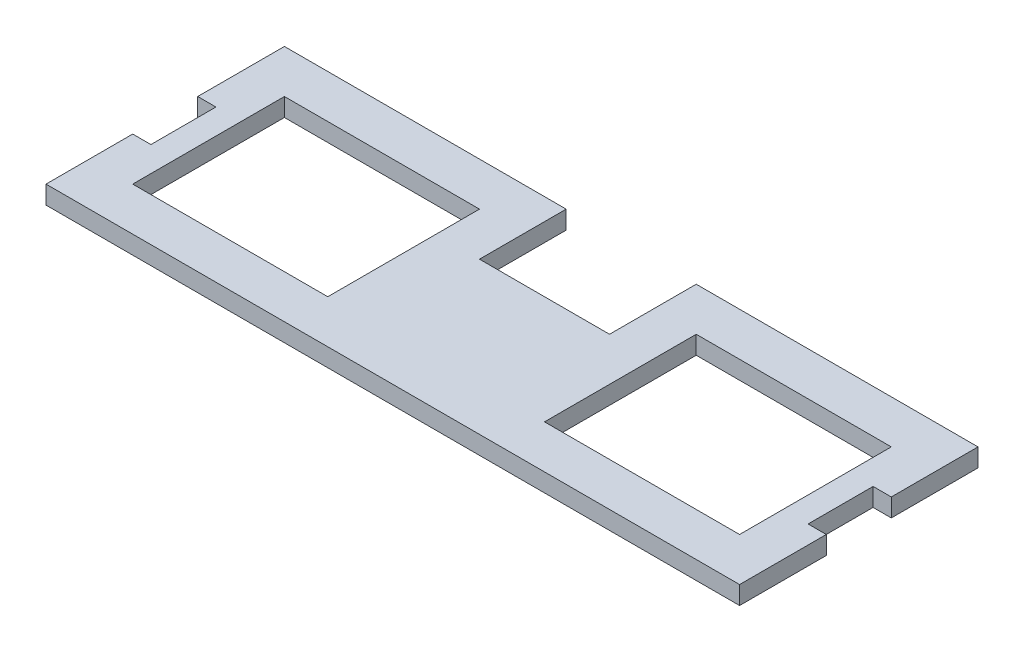
ISO-10303-21;
HEADER;
FILE_DESCRIPTION(('STEP AP214'),'2;1');
FILE_NAME('part.step','',(''),(''),'','','');
FILE_SCHEMA(('AUTOMOTIVE_DESIGN { 1 0 10303 214 1 1 1 1 }'));
ENDSEC;
DATA;
#1=APPLICATION_CONTEXT('core data for automotive mechanical design processes');
#2=APPLICATION_PROTOCOL_DEFINITION('international standard','automotive_design',2000,#1);
#3=PRODUCT_CONTEXT('',#1,'mechanical');
#4=PRODUCT('Part','Part','',(#3));
#5=PRODUCT_RELATED_PRODUCT_CATEGORY('part','',(#4));
#6=PRODUCT_DEFINITION_FORMATION('','',#4);
#7=PRODUCT_DEFINITION_CONTEXT('part definition',#1,'design');
#8=PRODUCT_DEFINITION('design','',#6,#7);
#9=PRODUCT_DEFINITION_SHAPE('','',#8);
#10=(LENGTH_UNIT() NAMED_UNIT(*) SI_UNIT(.MILLI.,.METRE.));
#11=(NAMED_UNIT(*) PLANE_ANGLE_UNIT() SI_UNIT($,.RADIAN.));
#12=(NAMED_UNIT(*) SI_UNIT($,.STERADIAN.) SOLID_ANGLE_UNIT());
#13=UNCERTAINTY_MEASURE_WITH_UNIT(LENGTH_MEASURE(1.E-05),#10,'distance_accuracy_value','');
#14=(GEOMETRIC_REPRESENTATION_CONTEXT(3) GLOBAL_UNCERTAINTY_ASSIGNED_CONTEXT((#13)) GLOBAL_UNIT_ASSIGNED_CONTEXT((#10,
#11,#12)) REPRESENTATION_CONTEXT('',''));
#15=CARTESIAN_POINT('',(0.,0.,0.));
#16=DIRECTION('',(0.,0.,1.));
#17=DIRECTION('',(1.,0.,0.));
#18=AXIS2_PLACEMENT_3D('',#15,#16,#17);
#19=CARTESIAN_POINT('',(0.,5.334,-69.85));
#20=DIRECTION('',(0.,0.,1.));
#21=DIRECTION('',(1.,0.,0.));
#22=AXIS2_PLACEMENT_3D('',#19,#20,#21);
#23=PLANE('',#22);
#24=DIRECTION('',(-1.,0.,0.));
#25=VECTOR('',#24,1.);
#26=CARTESIAN_POINT('',(0.,5.334,-69.85));
#27=LINE('',#26,#25);
#28=CARTESIAN_POINT('',(82.55,5.334,-69.85));
#29=VERTEX_POINT('',#28);
#30=CARTESIAN_POINT('',(0.,5.334,-69.85));
#31=VERTEX_POINT('',#30);
#32=EDGE_CURVE('E350',#29,#31,#27,.T.);
#33=ORIENTED_EDGE('',*,*,#32,.F.);
#34=DIRECTION('',(0.,1.,0.));
#35=VECTOR('',#34,1.);
#36=CARTESIAN_POINT('',(82.55,0.,-69.85));
#37=LINE('',#36,#35);
#38=CARTESIAN_POINT('',(82.55,0.,-69.85));
#39=VERTEX_POINT('',#38);
#40=EDGE_CURVE('E279',#39,#29,#37,.T.);
#41=ORIENTED_EDGE('',*,*,#40,.F.);
#42=DIRECTION('',(-1.,0.,0.));
#43=VECTOR('',#42,1.);
#44=CARTESIAN_POINT('',(0.,0.,-69.85));
#45=LINE('',#44,#43);
#46=CARTESIAN_POINT('',(0.,0.,-69.85));
#47=VERTEX_POINT('',#46);
#48=EDGE_CURVE('E364',#39,#47,#45,.T.);
#49=ORIENTED_EDGE('',*,*,#48,.T.);
#50=DIRECTION('',(0.,-1.,0.));
#51=VECTOR('',#50,1.);
#52=CARTESIAN_POINT('',(0.,5.334,-69.85));
#53=LINE('',#52,#51);
#54=EDGE_CURVE('E354',#31,#47,#53,.T.);
#55=ORIENTED_EDGE('',*,*,#54,.F.);
#56=EDGE_LOOP('',(#33,#41,#49,#55));
#57=FACE_BOUND('',#56,.T.);
#58=ADVANCED_FACE('F32',(#57),#23,.F.);
#59=CARTESIAN_POINT('',(203.2,5.334,0.));
#60=DIRECTION('',(-1.,0.,0.));
#61=DIRECTION('',(0.,0.,1.));
#62=AXIS2_PLACEMENT_3D('',#59,#60,#61);
#63=PLANE('',#62);
#64=DIRECTION('',(0.,0.,-1.));
#65=VECTOR('',#64,1.);
#66=CARTESIAN_POINT('',(203.2,5.334,0.));
#67=LINE('',#66,#65);
#68=CARTESIAN_POINT('',(203.2,5.334,-44.45));
#69=VERTEX_POINT('',#68);
#70=CARTESIAN_POINT('',(203.2,5.334,-69.85));
#71=VERTEX_POINT('',#70);
#72=EDGE_CURVE('E346',#69,#71,#67,.T.);
#73=ORIENTED_EDGE('',*,*,#72,.F.);
#74=DIRECTION('',(0.,1.,0.));
#75=VECTOR('',#74,1.);
#76=CARTESIAN_POINT('',(203.2,0.,-44.45));
#77=LINE('',#76,#75);
#78=CARTESIAN_POINT('',(203.2,0.,-44.45));
#79=VERTEX_POINT('',#78);
#80=EDGE_CURVE('E305',#79,#69,#77,.T.);
#81=ORIENTED_EDGE('',*,*,#80,.F.);
#82=DIRECTION('',(0.,0.,-1.));
#83=VECTOR('',#82,1.);
#84=CARTESIAN_POINT('',(203.2,0.,0.));
#85=LINE('',#84,#83);
#86=CARTESIAN_POINT('',(203.2,0.,-69.85));
#87=VERTEX_POINT('',#86);
#88=EDGE_CURVE('E360',#79,#87,#85,.T.);
#89=ORIENTED_EDGE('',*,*,#88,.T.);
#90=DIRECTION('',(0.,-1.,0.));
#91=VECTOR('',#90,1.);
#92=CARTESIAN_POINT('',(203.2,5.334,-69.85));
#93=LINE('',#92,#91);
#94=EDGE_CURVE('E370',#71,#87,#93,.T.);
#95=ORIENTED_EDGE('',*,*,#94,.F.);
#96=EDGE_LOOP('',(#73,#81,#89,#95));
#97=FACE_BOUND('',#96,.T.);
#98=ADVANCED_FACE('F438',(#97),#63,.F.);
#99=CARTESIAN_POINT('',(0.,5.334,0.));
#100=DIRECTION('',(1.,0.,0.));
#101=DIRECTION('',(0.,0.,-1.));
#102=AXIS2_PLACEMENT_3D('',#99,#100,#101);
#103=PLANE('',#102);
#104=DIRECTION('',(0.,0.,1.));
#105=VECTOR('',#104,1.);
#106=CARTESIAN_POINT('',(0.,0.,0.));
#107=LINE('',#106,#105);
#108=CARTESIAN_POINT('',(0.,0.,-44.45));
#109=VERTEX_POINT('',#108);
#110=EDGE_CURVE('E355',#47,#109,#107,.T.);
#111=ORIENTED_EDGE('',*,*,#110,.T.);
#112=DIRECTION('',(0.,1.,0.));
#113=VECTOR('',#112,1.);
#114=CARTESIAN_POINT('',(0.,0.,-44.45));
#115=LINE('',#114,#113);
#116=CARTESIAN_POINT('',(0.,5.334,-44.45));
#117=VERTEX_POINT('',#116);
#118=EDGE_CURVE('E331',#109,#117,#115,.T.);
#119=ORIENTED_EDGE('',*,*,#118,.T.);
#120=DIRECTION('',(0.,0.,1.));
#121=VECTOR('',#120,1.);
#122=CARTESIAN_POINT('',(0.,5.334,0.));
#123=LINE('',#122,#121);
#124=EDGE_CURVE('E340',#31,#117,#123,.T.);
#125=ORIENTED_EDGE('',*,*,#124,.F.);
#126=ORIENTED_EDGE('',*,*,#54,.T.);
#127=EDGE_LOOP('',(#111,#119,#125,#126));
#128=FACE_BOUND('',#127,.T.);
#129=ADVANCED_FACE('F414',(#128),#103,.F.);
#130=CARTESIAN_POINT('',(0.,5.334,-25.4));
#131=VERTEX_POINT('',#130);
#132=CARTESIAN_POINT('',(0.,5.334,0.));
#133=VERTEX_POINT('',#132);
#134=EDGE_CURVE('E344',#131,#133,#123,.T.);
#135=ORIENTED_EDGE('',*,*,#134,.F.);
#136=DIRECTION('',(0.,1.,0.));
#137=VECTOR('',#136,1.);
#138=CARTESIAN_POINT('',(0.,0.,-25.4));
#139=LINE('',#138,#137);
#140=CARTESIAN_POINT('',(0.,0.,-25.4));
#141=VERTEX_POINT('',#140);
#142=EDGE_CURVE('E324',#141,#131,#139,.T.);
#143=ORIENTED_EDGE('',*,*,#142,.F.);
#144=CARTESIAN_POINT('',(0.,0.,0.));
#145=VERTEX_POINT('',#144);
#146=EDGE_CURVE('E334',#141,#145,#107,.T.);
#147=ORIENTED_EDGE('',*,*,#146,.T.);
#148=DIRECTION('',(0.,-1.,0.));
#149=VECTOR('',#148,1.);
#150=CARTESIAN_POINT('',(0.,5.334,0.));
#151=LINE('',#150,#149);
#152=EDGE_CURVE('E11',#133,#145,#151,.T.);
#153=ORIENTED_EDGE('',*,*,#152,.F.);
#154=EDGE_LOOP('',(#135,#143,#147,#153));
#155=FACE_BOUND('',#154,.T.);
#156=ADVANCED_FACE('F34',(#155),#103,.F.);
#157=CARTESIAN_POINT('',(0.,5.334,0.));
#158=DIRECTION('',(0.,0.,-1.));
#159=DIRECTION('',(-1.,0.,0.));
#160=AXIS2_PLACEMENT_3D('',#157,#158,#159);
#161=PLANE('',#160);
#162=DIRECTION('',(1.,0.,0.));
#163=VECTOR('',#162,1.);
#164=CARTESIAN_POINT('',(0.,0.,0.));
#165=LINE('',#164,#163);
#166=CARTESIAN_POINT('',(203.2,0.,0.));
#167=VERTEX_POINT('',#166);
#168=EDGE_CURVE('E358',#145,#167,#165,.T.);
#169=ORIENTED_EDGE('',*,*,#168,.T.);
#170=DIRECTION('',(0.,-1.,0.));
#171=VECTOR('',#170,1.);
#172=CARTESIAN_POINT('',(203.2,5.334,0.));
#173=LINE('',#172,#171);
#174=CARTESIAN_POINT('',(203.2,5.334,0.));
#175=VERTEX_POINT('',#174);
#176=EDGE_CURVE('E40',#175,#167,#173,.T.);
#177=ORIENTED_EDGE('',*,*,#176,.F.);
#178=DIRECTION('',(1.,0.,0.));
#179=VECTOR('',#178,1.);
#180=CARTESIAN_POINT('',(0.,5.334,0.));
#181=LINE('',#180,#179);
#182=EDGE_CURVE('E343',#133,#175,#181,.T.);
#183=ORIENTED_EDGE('',*,*,#182,.F.);
#184=ORIENTED_EDGE('',*,*,#152,.T.);
#185=EDGE_LOOP('',(#169,#177,#183,#184));
#186=FACE_BOUND('',#185,.T.);
#187=ADVANCED_FACE('F398',(#186),#161,.F.);
#188=CARTESIAN_POINT('',(203.2,0.,-25.4));
#189=VERTEX_POINT('',#188);
#190=EDGE_CURVE('E361',#167,#189,#85,.T.);
#191=ORIENTED_EDGE('',*,*,#190,.T.);
#192=DIRECTION('',(0.,1.,0.));
#193=VECTOR('',#192,1.);
#194=CARTESIAN_POINT('',(203.2,0.,-25.4));
#195=LINE('',#194,#193);
#196=CARTESIAN_POINT('',(203.2,5.334,-25.4));
#197=VERTEX_POINT('',#196);
#198=EDGE_CURVE('E308',#189,#197,#195,.T.);
#199=ORIENTED_EDGE('',*,*,#198,.T.);
#200=EDGE_CURVE('E347',#175,#197,#67,.T.);
#201=ORIENTED_EDGE('',*,*,#200,.F.);
#202=ORIENTED_EDGE('',*,*,#176,.T.);
#203=EDGE_LOOP('',(#191,#199,#201,#202));
#204=FACE_BOUND('',#203,.T.);
#205=ADVANCED_FACE('F377',(#204),#63,.F.);
#206=CARTESIAN_POINT('',(120.65,0.,-69.85));
#207=VERTEX_POINT('',#206);
#208=EDGE_CURVE('E365',#87,#207,#45,.T.);
#209=ORIENTED_EDGE('',*,*,#208,.T.);
#210=DIRECTION('',(0.,1.,0.));
#211=VECTOR('',#210,1.);
#212=CARTESIAN_POINT('',(120.65,0.,-69.85));
#213=LINE('',#212,#211);
#214=CARTESIAN_POINT('',(120.65,5.334,-69.85));
#215=VERTEX_POINT('',#214);
#216=EDGE_CURVE('E282',#207,#215,#213,.T.);
#217=ORIENTED_EDGE('',*,*,#216,.T.);
#218=EDGE_CURVE('E351',#71,#215,#27,.T.);
#219=ORIENTED_EDGE('',*,*,#218,.F.);
#220=ORIENTED_EDGE('',*,*,#94,.T.);
#221=EDGE_LOOP('',(#209,#217,#219,#220));
#222=FACE_BOUND('',#221,.T.);
#223=ADVANCED_FACE('F433',(#222),#23,.F.);
#224=CARTESIAN_POINT('',(0.,5.334,0.));
#225=DIRECTION('',(0.,-1.,0.));
#226=DIRECTION('',(0.,0.,-1.));
#227=AXIS2_PLACEMENT_3D('',#224,#225,#226);
#228=PLANE('',#227);
#229=DIRECTION('',(1.,0.,0.));
#230=VECTOR('',#229,1.);
#231=CARTESIAN_POINT('',(12.7,5.334,-12.7));
#232=LINE('',#231,#230);
#233=CARTESIAN_POINT('',(12.7,5.334,-12.7));
#234=VERTEX_POINT('',#233);
#235=CARTESIAN_POINT('',(69.85,5.334,-12.6999999999985));
#236=VERTEX_POINT('',#235);
#237=EDGE_CURVE('E217',#234,#236,#232,.T.);
#238=ORIENTED_EDGE('',*,*,#237,.F.);
#239=DIRECTION('',(0.,0.,1.));
#240=VECTOR('',#239,1.);
#241=CARTESIAN_POINT('',(12.7,5.334,-25.4));
#242=LINE('',#241,#240);
#243=CARTESIAN_POINT('',(12.7,5.334,-57.15));
#244=VERTEX_POINT('',#243);
#245=EDGE_CURVE('E197',#244,#234,#242,.T.);
#246=ORIENTED_EDGE('',*,*,#245,.F.);
#247=DIRECTION('',(-1.,0.,0.));
#248=VECTOR('',#247,1.);
#249=CARTESIAN_POINT('',(69.85,5.334,-57.15));
#250=LINE('',#249,#248);
#251=CARTESIAN_POINT('',(69.85,5.334,-57.15));
#252=VERTEX_POINT('',#251);
#253=EDGE_CURVE('E212',#252,#244,#250,.T.);
#254=ORIENTED_EDGE('',*,*,#253,.F.);
#255=DIRECTION('',(0.,0.,-1.));
#256=VECTOR('',#255,1.);
#257=CARTESIAN_POINT('',(69.85,5.334,-44.45));
#258=LINE('',#257,#256);
#259=EDGE_CURVE('E219',#236,#252,#258,.T.);
#260=ORIENTED_EDGE('',*,*,#259,.F.);
#261=EDGE_LOOP('',(#238,#246,#254,#260));
#262=FACE_BOUND('',#261,.T.);
#263=DIRECTION('',(-1.,0.,0.));
#264=VECTOR('',#263,1.);
#265=CARTESIAN_POINT('',(133.35,5.334,-57.15));
#266=LINE('',#265,#264);
#267=CARTESIAN_POINT('',(190.5,5.334,-57.15));
#268=VERTEX_POINT('',#267);
#269=CARTESIAN_POINT('',(133.35,5.334,-57.15));
#270=VERTEX_POINT('',#269);
#271=EDGE_CURVE('E226',#268,#270,#266,.T.);
#272=ORIENTED_EDGE('',*,*,#271,.F.);
#273=DIRECTION('',(0.,0.,-1.));
#274=VECTOR('',#273,1.);
#275=CARTESIAN_POINT('',(190.5,5.334,-25.4));
#276=LINE('',#275,#274);
#277=CARTESIAN_POINT('',(190.5,5.334,-12.7));
#278=VERTEX_POINT('',#277);
#279=EDGE_CURVE('E234',#278,#268,#276,.T.);
#280=ORIENTED_EDGE('',*,*,#279,.F.);
#281=DIRECTION('',(1.,0.,0.));
#282=VECTOR('',#281,1.);
#283=CARTESIAN_POINT('',(190.5,5.334,-12.7));
#284=LINE('',#283,#282);
#285=CARTESIAN_POINT('',(133.35,5.334,-12.6999999999985));
#286=VERTEX_POINT('',#285);
#287=EDGE_CURVE('E249',#286,#278,#284,.T.);
#288=ORIENTED_EDGE('',*,*,#287,.F.);
#289=DIRECTION('',(0.,0.,1.));
#290=VECTOR('',#289,1.);
#291=CARTESIAN_POINT('',(133.35,5.334,-44.45));
#292=LINE('',#291,#290);
#293=EDGE_CURVE('E246',#270,#286,#292,.T.);
#294=ORIENTED_EDGE('',*,*,#293,.F.);
#295=EDGE_LOOP('',(#272,#280,#288,#294));
#296=FACE_BOUND('',#295,.T.);
#297=DIRECTION('',(1.,0.,0.));
#298=VECTOR('',#297,1.);
#299=CARTESIAN_POINT('',(82.55,5.334,-44.45));
#300=LINE('',#299,#298);
#301=CARTESIAN_POINT('',(82.55,5.334,-44.45));
#302=VERTEX_POINT('',#301);
#303=CARTESIAN_POINT('',(120.65,5.334,-44.45));
#304=VERTEX_POINT('',#303);
#305=EDGE_CURVE('E275',#302,#304,#300,.T.);
#306=ORIENTED_EDGE('',*,*,#305,.F.);
#307=DIRECTION('',(0.,0.,1.));
#308=VECTOR('',#307,1.);
#309=CARTESIAN_POINT('',(82.55,5.334,-69.85));
#310=LINE('',#309,#308);
#311=EDGE_CURVE('E256',#29,#302,#310,.T.);
#312=ORIENTED_EDGE('',*,*,#311,.F.);
#313=ORIENTED_EDGE('',*,*,#32,.T.);
#314=ORIENTED_EDGE('',*,*,#124,.T.);
#315=DIRECTION('',(-1.,0.,0.));
#316=VECTOR('',#315,1.);
#317=CARTESIAN_POINT('',(0.,5.334,-44.45));
#318=LINE('',#317,#316);
#319=CARTESIAN_POINT('',(5.33399999999994,5.334,-44.45));
#320=VERTEX_POINT('',#319);
#321=EDGE_CURVE('E318',#320,#117,#318,.T.);
#322=ORIENTED_EDGE('',*,*,#321,.F.);
#323=DIRECTION('',(0.,0.,-1.));
#324=VECTOR('',#323,1.);
#325=CARTESIAN_POINT('',(5.33399999999994,5.334,-44.45));
#326=LINE('',#325,#324);
#327=CARTESIAN_POINT('',(5.33399999999993,5.334,-25.4));
#328=VERTEX_POINT('',#327);
#329=EDGE_CURVE('E327',#328,#320,#326,.T.);
#330=ORIENTED_EDGE('',*,*,#329,.F.);
#331=DIRECTION('',(1.,0.,0.));
#332=VECTOR('',#331,1.);
#333=CARTESIAN_POINT('',(0.,5.334,-25.4));
#334=LINE('',#333,#332);
#335=EDGE_CURVE('E307',#131,#328,#334,.T.);
#336=ORIENTED_EDGE('',*,*,#335,.F.);
#337=ORIENTED_EDGE('',*,*,#134,.T.);
#338=ORIENTED_EDGE('',*,*,#182,.T.);
#339=ORIENTED_EDGE('',*,*,#200,.T.);
#340=DIRECTION('',(1.,0.,0.));
#341=VECTOR('',#340,1.);
#342=CARTESIAN_POINT('',(203.2,5.334,-25.4));
#343=LINE('',#342,#341);
#344=CARTESIAN_POINT('',(197.866,5.334,-25.4));
#345=VERTEX_POINT('',#344);
#346=EDGE_CURVE('E292',#345,#197,#343,.T.);
#347=ORIENTED_EDGE('',*,*,#346,.F.);
#348=DIRECTION('',(0.,0.,1.));
#349=VECTOR('',#348,1.);
#350=CARTESIAN_POINT('',(197.866,5.334,-44.45));
#351=LINE('',#350,#349);
#352=CARTESIAN_POINT('',(197.866,5.334,-44.45));
#353=VERTEX_POINT('',#352);
#354=EDGE_CURVE('E301',#353,#345,#351,.T.);
#355=ORIENTED_EDGE('',*,*,#354,.F.);
#356=DIRECTION('',(-1.,0.,0.));
#357=VECTOR('',#356,1.);
#358=CARTESIAN_POINT('',(203.2,5.334,-44.45));
#359=LINE('',#358,#357);
#360=EDGE_CURVE('E281',#69,#353,#359,.T.);
#361=ORIENTED_EDGE('',*,*,#360,.F.);
#362=ORIENTED_EDGE('',*,*,#72,.T.);
#363=ORIENTED_EDGE('',*,*,#218,.T.);
#364=DIRECTION('',(0.,0.,-1.));
#365=VECTOR('',#364,1.);
#366=CARTESIAN_POINT('',(120.65,5.334,-69.85));
#367=LINE('',#366,#365);
#368=EDGE_CURVE('E266',#304,#215,#367,.T.);
#369=ORIENTED_EDGE('',*,*,#368,.F.);
#370=EDGE_LOOP('',(#306,#312,#313,#314,#322,#330,#336,#337,#338,#339,#347,#355,#361,#362,#363,#369));
#371=FACE_BOUND('',#370,.T.);
#372=ADVANCED_FACE('F394',(#262,#296,#371),#228,.F.);
#373=CARTESIAN_POINT('',(0.,0.,0.));
#374=DIRECTION('',(0.,-1.,0.));
#375=DIRECTION('',(0.,0.,-1.));
#376=AXIS2_PLACEMENT_3D('',#373,#374,#375);
#377=PLANE('',#376);
#378=DIRECTION('',(0.,0.,1.));
#379=VECTOR('',#378,1.);
#380=CARTESIAN_POINT('',(12.7,0.,-25.4));
#381=LINE('',#380,#379);
#382=CARTESIAN_POINT('',(12.7,0.,-57.15));
#383=VERTEX_POINT('',#382);
#384=CARTESIAN_POINT('',(12.7,0.,-12.7));
#385=VERTEX_POINT('',#384);
#386=EDGE_CURVE('E194',#383,#385,#381,.T.);
#387=ORIENTED_EDGE('',*,*,#386,.T.);
#388=DIRECTION('',(1.,0.,0.));
#389=VECTOR('',#388,1.);
#390=CARTESIAN_POINT('',(12.7,0.,-12.7));
#391=LINE('',#390,#389);
#392=CARTESIAN_POINT('',(69.85,0.,-12.6999999999985));
#393=VERTEX_POINT('',#392);
#394=EDGE_CURVE('E203',#385,#393,#391,.T.);
#395=ORIENTED_EDGE('',*,*,#394,.T.);
#396=DIRECTION('',(0.,0.,-1.));
#397=VECTOR('',#396,1.);
#398=CARTESIAN_POINT('',(69.85,0.,-44.45));
#399=LINE('',#398,#397);
#400=CARTESIAN_POINT('',(69.85,0.,-57.15));
#401=VERTEX_POINT('',#400);
#402=EDGE_CURVE('E55',#393,#401,#399,.T.);
#403=ORIENTED_EDGE('',*,*,#402,.T.);
#404=DIRECTION('',(-1.,0.,0.));
#405=VECTOR('',#404,1.);
#406=CARTESIAN_POINT('',(69.85,0.,-57.15));
#407=LINE('',#406,#405);
#408=EDGE_CURVE('E200',#401,#383,#407,.T.);
#409=ORIENTED_EDGE('',*,*,#408,.T.);
#410=EDGE_LOOP('',(#387,#395,#403,#409));
#411=FACE_BOUND('',#410,.T.);
#412=DIRECTION('',(0.,0.,-1.));
#413=VECTOR('',#412,1.);
#414=CARTESIAN_POINT('',(190.5,0.,-25.4));
#415=LINE('',#414,#413);
#416=CARTESIAN_POINT('',(190.5,0.,-12.7));
#417=VERTEX_POINT('',#416);
#418=CARTESIAN_POINT('',(190.5,0.,-57.15));
#419=VERTEX_POINT('',#418);
#420=EDGE_CURVE('E230',#417,#419,#415,.T.);
#421=ORIENTED_EDGE('',*,*,#420,.T.);
#422=DIRECTION('',(-1.,0.,0.));
#423=VECTOR('',#422,1.);
#424=CARTESIAN_POINT('',(133.35,0.,-57.15));
#425=LINE('',#424,#423);
#426=CARTESIAN_POINT('',(133.35,0.,-57.15));
#427=VERTEX_POINT('',#426);
#428=EDGE_CURVE('E233',#419,#427,#425,.T.);
#429=ORIENTED_EDGE('',*,*,#428,.T.);
#430=DIRECTION('',(0.,0.,1.));
#431=VECTOR('',#430,1.);
#432=CARTESIAN_POINT('',(133.35,0.,-44.45));
#433=LINE('',#432,#431);
#434=CARTESIAN_POINT('',(133.35,0.,-12.6999999999985));
#435=VERTEX_POINT('',#434);
#436=EDGE_CURVE('E237',#427,#435,#433,.T.);
#437=ORIENTED_EDGE('',*,*,#436,.T.);
#438=DIRECTION('',(1.,0.,0.));
#439=VECTOR('',#438,1.);
#440=CARTESIAN_POINT('',(190.5,0.,-12.7));
#441=LINE('',#440,#439);
#442=EDGE_CURVE('E240',#435,#417,#441,.T.);
#443=ORIENTED_EDGE('',*,*,#442,.T.);
#444=EDGE_LOOP('',(#421,#429,#437,#443));
#445=FACE_BOUND('',#444,.T.);
#446=DIRECTION('',(0.,0.,1.));
#447=VECTOR('',#446,1.);
#448=CARTESIAN_POINT('',(82.55,0.,-69.85));
#449=LINE('',#448,#447);
#450=CARTESIAN_POINT('',(82.55,0.,-44.45));
#451=VERTEX_POINT('',#450);
#452=EDGE_CURVE('E262',#39,#451,#449,.T.);
#453=ORIENTED_EDGE('',*,*,#452,.T.);
#454=DIRECTION('',(1.,0.,0.));
#455=VECTOR('',#454,1.);
#456=CARTESIAN_POINT('',(82.55,0.,-44.45));
#457=LINE('',#456,#455);
#458=CARTESIAN_POINT('',(120.65,0.,-44.45));
#459=VERTEX_POINT('',#458);
#460=EDGE_CURVE('E265',#451,#459,#457,.T.);
#461=ORIENTED_EDGE('',*,*,#460,.T.);
#462=DIRECTION('',(0.,0.,-1.));
#463=VECTOR('',#462,1.);
#464=CARTESIAN_POINT('',(120.65,0.,-69.85));
#465=LINE('',#464,#463);
#466=EDGE_CURVE('E269',#459,#207,#465,.T.);
#467=ORIENTED_EDGE('',*,*,#466,.T.);
#468=ORIENTED_EDGE('',*,*,#208,.F.);
#469=ORIENTED_EDGE('',*,*,#88,.F.);
#470=DIRECTION('',(-1.,0.,0.));
#471=VECTOR('',#470,1.);
#472=CARTESIAN_POINT('',(203.2,0.,-44.45));
#473=LINE('',#472,#471);
#474=CARTESIAN_POINT('',(197.866,0.,-44.45));
#475=VERTEX_POINT('',#474);
#476=EDGE_CURVE('E288',#79,#475,#473,.T.);
#477=ORIENTED_EDGE('',*,*,#476,.T.);
#478=DIRECTION('',(0.,0.,1.));
#479=VECTOR('',#478,1.);
#480=CARTESIAN_POINT('',(197.866,0.,-44.45));
#481=LINE('',#480,#479);
#482=CARTESIAN_POINT('',(197.866,0.,-25.4));
#483=VERTEX_POINT('',#482);
#484=EDGE_CURVE('E291',#475,#483,#481,.T.);
#485=ORIENTED_EDGE('',*,*,#484,.T.);
#486=DIRECTION('',(1.,0.,0.));
#487=VECTOR('',#486,1.);
#488=CARTESIAN_POINT('',(203.2,0.,-25.4));
#489=LINE('',#488,#487);
#490=EDGE_CURVE('E295',#483,#189,#489,.T.);
#491=ORIENTED_EDGE('',*,*,#490,.T.);
#492=ORIENTED_EDGE('',*,*,#190,.F.);
#493=ORIENTED_EDGE('',*,*,#168,.F.);
#494=ORIENTED_EDGE('',*,*,#146,.F.);
#495=DIRECTION('',(1.,0.,0.));
#496=VECTOR('',#495,1.);
#497=CARTESIAN_POINT('',(0.,0.,-25.4));
#498=LINE('',#497,#496);
#499=CARTESIAN_POINT('',(5.33399999999993,0.,-25.4));
#500=VERTEX_POINT('',#499);
#501=EDGE_CURVE('E314',#141,#500,#498,.T.);
#502=ORIENTED_EDGE('',*,*,#501,.T.);
#503=DIRECTION('',(0.,0.,-1.));
#504=VECTOR('',#503,1.);
#505=CARTESIAN_POINT('',(5.33399999999994,0.,-44.45));
#506=LINE('',#505,#504);
#507=CARTESIAN_POINT('',(5.33399999999994,0.,-44.45));
#508=VERTEX_POINT('',#507);
#509=EDGE_CURVE('E317',#500,#508,#506,.T.);
#510=ORIENTED_EDGE('',*,*,#509,.T.);
#511=DIRECTION('',(-1.,0.,0.));
#512=VECTOR('',#511,1.);
#513=CARTESIAN_POINT('',(0.,0.,-44.45));
#514=LINE('',#513,#512);
#515=EDGE_CURVE('E321',#508,#109,#514,.T.);
#516=ORIENTED_EDGE('',*,*,#515,.T.);
#517=ORIENTED_EDGE('',*,*,#110,.F.);
#518=ORIENTED_EDGE('',*,*,#48,.F.);
#519=EDGE_LOOP('',(#453,#461,#467,#468,#469,#477,#485,#491,#492,#493,#494,#502,#510,#516,#517,#518));
#520=FACE_BOUND('',#519,.T.);
#521=ADVANCED_FACE('F208',(#411,#445,#520),#377,.T.);
#522=CARTESIAN_POINT('',(0.,0.,-44.45));
#523=DIRECTION('',(0.,0.,-1.));
#524=DIRECTION('',(-1.,0.,0.));
#525=AXIS2_PLACEMENT_3D('',#522,#523,#524);
#526=PLANE('',#525);
#527=ORIENTED_EDGE('',*,*,#321,.T.);
#528=ORIENTED_EDGE('',*,*,#118,.F.);
#529=ORIENTED_EDGE('',*,*,#515,.F.);
#530=DIRECTION('',(0.,1.,0.));
#531=VECTOR('',#530,1.);
#532=CARTESIAN_POINT('',(5.33399999999994,0.,-44.45));
#533=LINE('',#532,#531);
#534=EDGE_CURVE('E335',#508,#320,#533,.T.);
#535=ORIENTED_EDGE('',*,*,#534,.T.);
#536=EDGE_LOOP('',(#527,#528,#529,#535));
#537=FACE_BOUND('',#536,.T.);
#538=ADVANCED_FACE('F410',(#537),#526,.F.);
#539=CARTESIAN_POINT('',(5.33399999999994,0.,-44.45));
#540=DIRECTION('',(1.,0.,0.));
#541=DIRECTION('',(0.,0.,-1.));
#542=AXIS2_PLACEMENT_3D('',#539,#540,#541);
#543=PLANE('',#542);
#544=ORIENTED_EDGE('',*,*,#329,.T.);
#545=ORIENTED_EDGE('',*,*,#534,.F.);
#546=ORIENTED_EDGE('',*,*,#509,.F.);
#547=DIRECTION('',(0.,1.,0.));
#548=VECTOR('',#547,1.);
#549=CARTESIAN_POINT('',(5.33399999999993,0.,-25.4));
#550=LINE('',#549,#548);
#551=EDGE_CURVE('E337',#500,#328,#550,.T.);
#552=ORIENTED_EDGE('',*,*,#551,.T.);
#553=EDGE_LOOP('',(#544,#545,#546,#552));
#554=FACE_BOUND('',#553,.T.);
#555=ADVANCED_FACE('F406',(#554),#543,.F.);
#556=CARTESIAN_POINT('',(0.,0.,-25.4));
#557=DIRECTION('',(0.,0.,1.));
#558=DIRECTION('',(1.,0.,0.));
#559=AXIS2_PLACEMENT_3D('',#556,#557,#558);
#560=PLANE('',#559);
#561=ORIENTED_EDGE('',*,*,#335,.T.);
#562=ORIENTED_EDGE('',*,*,#551,.F.);
#563=ORIENTED_EDGE('',*,*,#501,.F.);
#564=ORIENTED_EDGE('',*,*,#142,.T.);
#565=EDGE_LOOP('',(#561,#562,#563,#564));
#566=FACE_BOUND('',#565,.T.);
#567=ADVANCED_FACE('F403',(#566),#560,.F.);
#568=CARTESIAN_POINT('',(203.2,0.,-44.45));
#569=DIRECTION('',(0.,0.,-1.));
#570=DIRECTION('',(-1.,0.,0.));
#571=AXIS2_PLACEMENT_3D('',#568,#569,#570);
#572=PLANE('',#571);
#573=ORIENTED_EDGE('',*,*,#360,.T.);
#574=DIRECTION('',(0.,1.,0.));
#575=VECTOR('',#574,1.);
#576=CARTESIAN_POINT('',(197.866,0.,-44.45));
#577=LINE('',#576,#575);
#578=EDGE_CURVE('E298',#475,#353,#577,.T.);
#579=ORIENTED_EDGE('',*,*,#578,.F.);
#580=ORIENTED_EDGE('',*,*,#476,.F.);
#581=ORIENTED_EDGE('',*,*,#80,.T.);
#582=EDGE_LOOP('',(#573,#579,#580,#581));
#583=FACE_BOUND('',#582,.T.);
#584=ADVANCED_FACE('F441',(#583),#572,.F.);
#585=CARTESIAN_POINT('',(203.2,0.,-25.4));
#586=DIRECTION('',(0.,0.,1.));
#587=DIRECTION('',(1.,0.,0.));
#588=AXIS2_PLACEMENT_3D('',#585,#586,#587);
#589=PLANE('',#588);
#590=ORIENTED_EDGE('',*,*,#346,.T.);
#591=ORIENTED_EDGE('',*,*,#198,.F.);
#592=ORIENTED_EDGE('',*,*,#490,.F.);
#593=DIRECTION('',(0.,1.,0.));
#594=VECTOR('',#593,1.);
#595=CARTESIAN_POINT('',(197.866,0.,-25.4));
#596=LINE('',#595,#594);
#597=EDGE_CURVE('E311',#483,#345,#596,.T.);
#598=ORIENTED_EDGE('',*,*,#597,.T.);
#599=EDGE_LOOP('',(#590,#591,#592,#598));
#600=FACE_BOUND('',#599,.T.);
#601=ADVANCED_FACE('F386',(#600),#589,.F.);
#602=CARTESIAN_POINT('',(197.866,0.,-44.45));
#603=DIRECTION('',(-1.,0.,0.));
#604=DIRECTION('',(0.,0.,1.));
#605=AXIS2_PLACEMENT_3D('',#602,#603,#604);
#606=PLANE('',#605);
#607=ORIENTED_EDGE('',*,*,#354,.T.);
#608=ORIENTED_EDGE('',*,*,#597,.F.);
#609=ORIENTED_EDGE('',*,*,#484,.F.);
#610=ORIENTED_EDGE('',*,*,#578,.T.);
#611=EDGE_LOOP('',(#607,#608,#609,#610));
#612=FACE_BOUND('',#611,.T.);
#613=ADVANCED_FACE('F388',(#612),#606,.F.);
#614=CARTESIAN_POINT('',(82.55,0.,-69.85));
#615=DIRECTION('',(-1.,0.,0.));
#616=DIRECTION('',(0.,0.,1.));
#617=AXIS2_PLACEMENT_3D('',#614,#615,#616);
#618=PLANE('',#617);
#619=ORIENTED_EDGE('',*,*,#311,.T.);
#620=DIRECTION('',(0.,1.,0.));
#621=VECTOR('',#620,1.);
#622=CARTESIAN_POINT('',(82.55,0.,-44.45));
#623=LINE('',#622,#621);
#624=EDGE_CURVE('E272',#451,#302,#623,.T.);
#625=ORIENTED_EDGE('',*,*,#624,.F.);
#626=ORIENTED_EDGE('',*,*,#452,.F.);
#627=ORIENTED_EDGE('',*,*,#40,.T.);
#628=EDGE_LOOP('',(#619,#625,#626,#627));
#629=FACE_BOUND('',#628,.T.);
#630=ADVANCED_FACE('F422',(#629),#618,.F.);
#631=CARTESIAN_POINT('',(120.65,0.,-69.85));
#632=DIRECTION('',(1.,0.,0.));
#633=DIRECTION('',(0.,0.,-1.));
#634=AXIS2_PLACEMENT_3D('',#631,#632,#633);
#635=PLANE('',#634);
#636=ORIENTED_EDGE('',*,*,#368,.T.);
#637=ORIENTED_EDGE('',*,*,#216,.F.);
#638=ORIENTED_EDGE('',*,*,#466,.F.);
#639=DIRECTION('',(0.,1.,0.));
#640=VECTOR('',#639,1.);
#641=CARTESIAN_POINT('',(120.65,0.,-44.45));
#642=LINE('',#641,#640);
#643=EDGE_CURVE('E285',#459,#304,#642,.T.);
#644=ORIENTED_EDGE('',*,*,#643,.T.);
#645=EDGE_LOOP('',(#636,#637,#638,#644));
#646=FACE_BOUND('',#645,.T.);
#647=ADVANCED_FACE('F429',(#646),#635,.F.);
#648=CARTESIAN_POINT('',(82.55,0.,-44.45));
#649=DIRECTION('',(0.,0.,1.));
#650=DIRECTION('',(1.,0.,0.));
#651=AXIS2_PLACEMENT_3D('',#648,#649,#650);
#652=PLANE('',#651);
#653=ORIENTED_EDGE('',*,*,#305,.T.);
#654=ORIENTED_EDGE('',*,*,#643,.F.);
#655=ORIENTED_EDGE('',*,*,#460,.F.);
#656=ORIENTED_EDGE('',*,*,#624,.T.);
#657=EDGE_LOOP('',(#653,#654,#655,#656));
#658=FACE_BOUND('',#657,.T.);
#659=ADVANCED_FACE('F426',(#658),#652,.F.);
#660=CARTESIAN_POINT('',(190.5,0.,-25.4));
#661=DIRECTION('',(1.,0.,0.));
#662=DIRECTION('',(0.,0.,-1.));
#663=AXIS2_PLACEMENT_3D('',#660,#661,#662);
#664=PLANE('',#663);
#665=ORIENTED_EDGE('',*,*,#279,.T.);
#666=DIRECTION('',(0.,1.,0.));
#667=VECTOR('',#666,1.);
#668=CARTESIAN_POINT('',(190.5,0.,-57.15));
#669=LINE('',#668,#667);
#670=EDGE_CURVE('E243',#419,#268,#669,.T.);
#671=ORIENTED_EDGE('',*,*,#670,.F.);
#672=ORIENTED_EDGE('',*,*,#420,.F.);
#673=DIRECTION('',(0.,1.,0.));
#674=VECTOR('',#673,1.);
#675=CARTESIAN_POINT('',(190.5,0.,-12.7));
#676=LINE('',#675,#674);
#677=EDGE_CURVE('E254',#417,#278,#676,.T.);
#678=ORIENTED_EDGE('',*,*,#677,.T.);
#679=EDGE_LOOP('',(#665,#671,#672,#678));
#680=FACE_BOUND('',#679,.T.);
#681=ADVANCED_FACE('F520',(#680),#664,.F.);
#682=CARTESIAN_POINT('',(190.5,0.,-12.7));
#683=DIRECTION('',(0.,0.,1.));
#684=DIRECTION('',(1.,0.,0.));
#685=AXIS2_PLACEMENT_3D('',#682,#683,#684);
#686=PLANE('',#685);
#687=ORIENTED_EDGE('',*,*,#287,.T.);
#688=ORIENTED_EDGE('',*,*,#677,.F.);
#689=ORIENTED_EDGE('',*,*,#442,.F.);
#690=DIRECTION('',(0.,1.,0.));
#691=VECTOR('',#690,1.);
#692=CARTESIAN_POINT('',(133.35,0.,-12.6999999999985));
#693=LINE('',#692,#691);
#694=EDGE_CURVE('E257',#435,#286,#693,.T.);
#695=ORIENTED_EDGE('',*,*,#694,.T.);
#696=EDGE_LOOP('',(#687,#688,#689,#695));
#697=FACE_BOUND('',#696,.T.);
#698=ADVANCED_FACE('F525',(#697),#686,.F.);
#699=CARTESIAN_POINT('',(133.35,0.,-44.45));
#700=DIRECTION('',(-1.,0.,0.));
#701=DIRECTION('',(0.,0.,1.));
#702=AXIS2_PLACEMENT_3D('',#699,#700,#701);
#703=PLANE('',#702);
#704=ORIENTED_EDGE('',*,*,#293,.T.);
#705=ORIENTED_EDGE('',*,*,#694,.F.);
#706=ORIENTED_EDGE('',*,*,#436,.F.);
#707=DIRECTION('',(0.,1.,0.));
#708=VECTOR('',#707,1.);
#709=CARTESIAN_POINT('',(133.35,0.,-57.15));
#710=LINE('',#709,#708);
#711=EDGE_CURVE('E259',#427,#270,#710,.T.);
#712=ORIENTED_EDGE('',*,*,#711,.T.);
#713=EDGE_LOOP('',(#704,#705,#706,#712));
#714=FACE_BOUND('',#713,.T.);
#715=ADVANCED_FACE('F537',(#714),#703,.F.);
#716=CARTESIAN_POINT('',(133.35,0.,-57.15));
#717=DIRECTION('',(0.,0.,-1.));
#718=DIRECTION('',(-1.,0.,0.));
#719=AXIS2_PLACEMENT_3D('',#716,#717,#718);
#720=PLANE('',#719);
#721=ORIENTED_EDGE('',*,*,#271,.T.);
#722=ORIENTED_EDGE('',*,*,#711,.F.);
#723=ORIENTED_EDGE('',*,*,#428,.F.);
#724=ORIENTED_EDGE('',*,*,#670,.T.);
#725=EDGE_LOOP('',(#721,#722,#723,#724));
#726=FACE_BOUND('',#725,.T.);
#727=ADVANCED_FACE('F548',(#726),#720,.F.);
#728=CARTESIAN_POINT('',(12.7,0.,-25.4));
#729=DIRECTION('',(-1.,0.,0.));
#730=DIRECTION('',(0.,0.,1.));
#731=AXIS2_PLACEMENT_3D('',#728,#729,#730);
#732=PLANE('',#731);
#733=ORIENTED_EDGE('',*,*,#245,.T.);
#734=DIRECTION('',(0.,1.,0.));
#735=VECTOR('',#734,1.);
#736=CARTESIAN_POINT('',(12.7,0.,-12.7));
#737=LINE('',#736,#735);
#738=EDGE_CURVE('E47',#385,#234,#737,.T.);
#739=ORIENTED_EDGE('',*,*,#738,.F.);
#740=ORIENTED_EDGE('',*,*,#386,.F.);
#741=DIRECTION('',(0.,1.,0.));
#742=VECTOR('',#741,1.);
#743=CARTESIAN_POINT('',(12.7,0.,-57.15));
#744=LINE('',#743,#742);
#745=EDGE_CURVE('E224',#383,#244,#744,.T.);
#746=ORIENTED_EDGE('',*,*,#745,.T.);
#747=EDGE_LOOP('',(#733,#739,#740,#746));
#748=FACE_BOUND('',#747,.T.);
#749=ADVANCED_FACE('F192',(#748),#732,.F.);
#750=CARTESIAN_POINT('',(69.85,0.,-57.15));
#751=DIRECTION('',(0.,0.,-1.));
#752=DIRECTION('',(-1.,0.,0.));
#753=AXIS2_PLACEMENT_3D('',#750,#751,#752);
#754=PLANE('',#753);
#755=ORIENTED_EDGE('',*,*,#253,.T.);
#756=ORIENTED_EDGE('',*,*,#745,.F.);
#757=ORIENTED_EDGE('',*,*,#408,.F.);
#758=DIRECTION('',(0.,1.,0.));
#759=VECTOR('',#758,1.);
#760=CARTESIAN_POINT('',(69.85,0.,-57.15));
#761=LINE('',#760,#759);
#762=EDGE_CURVE('E227',#401,#252,#761,.T.);
#763=ORIENTED_EDGE('',*,*,#762,.T.);
#764=EDGE_LOOP('',(#755,#756,#757,#763));
#765=FACE_BOUND('',#764,.T.);
#766=ADVANCED_FACE('F568',(#765),#754,.F.);
#767=CARTESIAN_POINT('',(69.85,0.,-44.45));
#768=DIRECTION('',(1.,0.,0.));
#769=DIRECTION('',(0.,0.,-1.));
#770=AXIS2_PLACEMENT_3D('',#767,#768,#769);
#771=PLANE('',#770);
#772=ORIENTED_EDGE('',*,*,#259,.T.);
#773=ORIENTED_EDGE('',*,*,#762,.F.);
#774=ORIENTED_EDGE('',*,*,#402,.F.);
#775=DIRECTION('',(0.,1.,0.));
#776=VECTOR('',#775,1.);
#777=CARTESIAN_POINT('',(69.85,0.,-12.6999999999985));
#778=LINE('',#777,#776);
#779=EDGE_CURVE('E199',#393,#236,#778,.T.);
#780=ORIENTED_EDGE('',*,*,#779,.T.);
#781=EDGE_LOOP('',(#772,#773,#774,#780));
#782=FACE_BOUND('',#781,.T.);
#783=ADVANCED_FACE('F578',(#782),#771,.F.);
#784=CARTESIAN_POINT('',(12.7,0.,-12.7));
#785=DIRECTION('',(0.,0.,1.));
#786=DIRECTION('',(1.,0.,0.));
#787=AXIS2_PLACEMENT_3D('',#784,#785,#786);
#788=PLANE('',#787);
#789=ORIENTED_EDGE('',*,*,#237,.T.);
#790=ORIENTED_EDGE('',*,*,#779,.F.);
#791=ORIENTED_EDGE('',*,*,#394,.F.);
#792=ORIENTED_EDGE('',*,*,#738,.T.);
#793=EDGE_LOOP('',(#789,#790,#791,#792));
#794=FACE_BOUND('',#793,.T.);
#795=ADVANCED_FACE('F204',(#794),#788,.F.);
#796=CLOSED_SHELL('',(#58,#98,#129,#156,#187,#205,#223,#372,#521,#538,#555,#567,#584,#601,#613,
#630,#647,#659,#681,#698,#715,#727,#749,#766,#783,#795));
#797=MANIFOLD_SOLID_BREP('B2',#796);
#798=ADVANCED_BREP_SHAPE_REPRESENTATION('',(#18,#797),#14);
#799=SHAPE_DEFINITION_REPRESENTATION(#9,#798);
ENDSEC;
END-ISO-10303-21;
